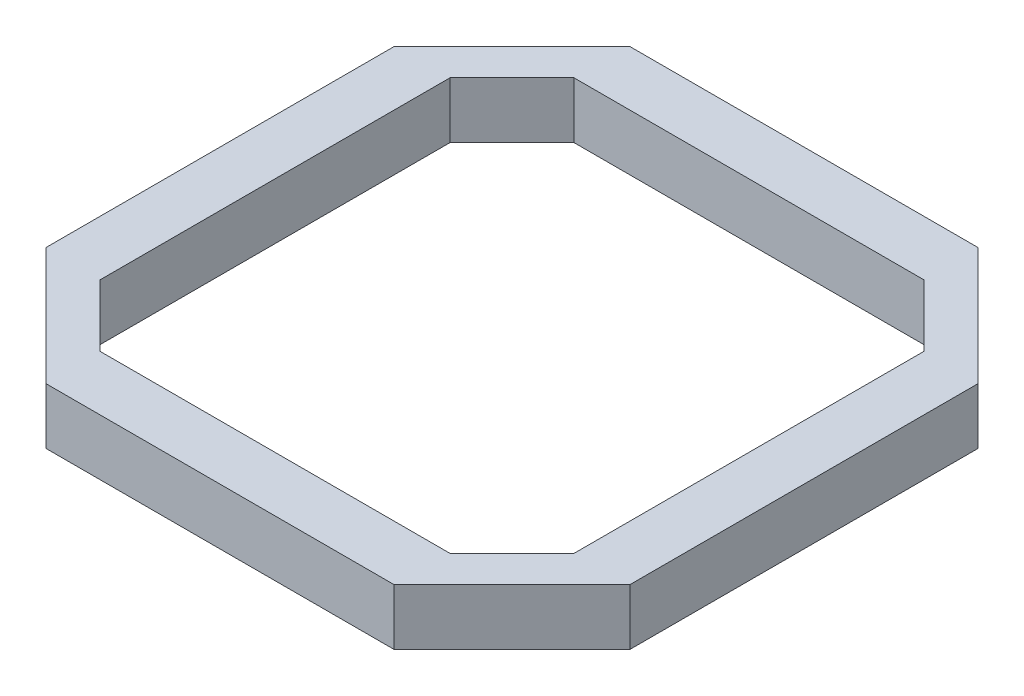
ISO-10303-21;
HEADER;
FILE_DESCRIPTION(('STEP AP214'),'2;1');
FILE_NAME('part.step','',(''),(''),'','','');
FILE_SCHEMA(('AUTOMOTIVE_DESIGN { 1 0 10303 214 1 1 1 1 }'));
ENDSEC;
DATA;
#1=APPLICATION_CONTEXT('core data for automotive mechanical design processes');
#2=APPLICATION_PROTOCOL_DEFINITION('international standard','automotive_design',2000,#1);
#3=PRODUCT_CONTEXT('',#1,'mechanical');
#4=PRODUCT('Part','Part','',(#3));
#5=PRODUCT_RELATED_PRODUCT_CATEGORY('part','',(#4));
#6=PRODUCT_DEFINITION_FORMATION('','',#4);
#7=PRODUCT_DEFINITION_CONTEXT('part definition',#1,'design');
#8=PRODUCT_DEFINITION('design','',#6,#7);
#9=PRODUCT_DEFINITION_SHAPE('','',#8);
#10=(LENGTH_UNIT() NAMED_UNIT(*) SI_UNIT(.MILLI.,.METRE.));
#11=(NAMED_UNIT(*) PLANE_ANGLE_UNIT() SI_UNIT($,.RADIAN.));
#12=(NAMED_UNIT(*) SI_UNIT($,.STERADIAN.) SOLID_ANGLE_UNIT());
#13=UNCERTAINTY_MEASURE_WITH_UNIT(LENGTH_MEASURE(1.E-05),#10,'distance_accuracy_value','');
#14=(GEOMETRIC_REPRESENTATION_CONTEXT(3) GLOBAL_UNCERTAINTY_ASSIGNED_CONTEXT((#13)) GLOBAL_UNIT_ASSIGNED_CONTEXT((#10,
#11,#12)) REPRESENTATION_CONTEXT('',''));
#15=CARTESIAN_POINT('',(0.,0.,0.));
#16=DIRECTION('',(0.,0.,1.));
#17=DIRECTION('',(1.,0.,0.));
#18=AXIS2_PLACEMENT_3D('',#15,#16,#17);
#19=CARTESIAN_POINT('',(-26.,5.,15.5));
#20=DIRECTION('',(0.707106781186551,0.,-0.707106781186544));
#21=DIRECTION('',(-0.707106781186544,0.,-0.707106781186551));
#22=AXIS2_PLACEMENT_3D('',#19,#20,#21);
#23=PLANE('',#22);
#24=DIRECTION('',(0.707106781186544,0.,0.707106781186551));
#25=VECTOR('',#24,1.);
#26=CARTESIAN_POINT('',(-26.,0.,15.5));
#27=LINE('',#26,#25);
#28=CARTESIAN_POINT('',(-26.,0.,15.5));
#29=VERTEX_POINT('',#28);
#30=CARTESIAN_POINT('',(-15.5000000000001,0.,26.));
#31=VERTEX_POINT('',#30);
#32=EDGE_CURVE('E210',#29,#31,#27,.T.);
#33=ORIENTED_EDGE('',*,*,#32,.T.);
#34=DIRECTION('',(0.,-1.,0.));
#35=VECTOR('',#34,1.);
#36=CARTESIAN_POINT('',(-15.5000000000001,5.,26.));
#37=LINE('',#36,#35);
#38=CARTESIAN_POINT('',(-15.5000000000001,5.,26.));
#39=VERTEX_POINT('',#38);
#40=EDGE_CURVE('E11',#39,#31,#37,.T.);
#41=ORIENTED_EDGE('',*,*,#40,.F.);
#42=DIRECTION('',(0.707106781186544,0.,0.707106781186551));
#43=VECTOR('',#42,1.);
#44=CARTESIAN_POINT('',(-26.,5.,15.5));
#45=LINE('',#44,#43);
#46=CARTESIAN_POINT('',(-26.,5.,15.5));
#47=VERTEX_POINT('',#46);
#48=EDGE_CURVE('E222',#47,#39,#45,.T.);
#49=ORIENTED_EDGE('',*,*,#48,.F.);
#50=DIRECTION('',(0.,-1.,0.));
#51=VECTOR('',#50,1.);
#52=CARTESIAN_POINT('',(-26.,5.,15.5));
#53=LINE('',#52,#51);
#54=EDGE_CURVE('E240',#47,#29,#53,.T.);
#55=ORIENTED_EDGE('',*,*,#54,.T.);
#56=EDGE_LOOP('',(#33,#41,#49,#55));
#57=FACE_BOUND('',#56,.T.);
#58=ADVANCED_FACE('F41',(#57),#23,.F.);
#59=CARTESIAN_POINT('',(-15.5000000000001,5.,26.));
#60=DIRECTION('',(0.,0.,-1.));
#61=DIRECTION('',(-1.,0.,0.));
#62=AXIS2_PLACEMENT_3D('',#59,#60,#61);
#63=PLANE('',#62);
#64=DIRECTION('',(1.,0.,0.));
#65=VECTOR('',#64,1.);
#66=CARTESIAN_POINT('',(-15.5000000000001,0.,26.));
#67=LINE('',#66,#65);
#68=CARTESIAN_POINT('',(15.5,0.,26.));
#69=VERTEX_POINT('',#68);
#70=EDGE_CURVE('E243',#31,#69,#67,.T.);
#71=ORIENTED_EDGE('',*,*,#70,.T.);
#72=DIRECTION('',(0.,-1.,0.));
#73=VECTOR('',#72,1.);
#74=CARTESIAN_POINT('',(15.5,5.,26.));
#75=LINE('',#74,#73);
#76=CARTESIAN_POINT('',(15.5,5.,26.));
#77=VERTEX_POINT('',#76);
#78=EDGE_CURVE('E48',#77,#69,#75,.T.);
#79=ORIENTED_EDGE('',*,*,#78,.F.);
#80=DIRECTION('',(1.,0.,0.));
#81=VECTOR('',#80,1.);
#82=CARTESIAN_POINT('',(-15.5000000000001,5.,26.));
#83=LINE('',#82,#81);
#84=EDGE_CURVE('E225',#39,#77,#83,.T.);
#85=ORIENTED_EDGE('',*,*,#84,.F.);
#86=ORIENTED_EDGE('',*,*,#40,.T.);
#87=EDGE_LOOP('',(#71,#79,#85,#86));
#88=FACE_BOUND('',#87,.T.);
#89=ADVANCED_FACE('F298',(#88),#63,.F.);
#90=CARTESIAN_POINT('',(15.5,5.,26.));
#91=DIRECTION('',(-0.707106781186548,0.,-0.707106781186548));
#92=DIRECTION('',(-0.707106781186548,0.,0.707106781186548));
#93=AXIS2_PLACEMENT_3D('',#90,#91,#92);
#94=PLANE('',#93);
#95=DIRECTION('',(0.707106781186548,0.,-0.707106781186548));
#96=VECTOR('',#95,1.);
#97=CARTESIAN_POINT('',(15.5,0.,26.));
#98=LINE('',#97,#96);
#99=CARTESIAN_POINT('',(26.,0.,15.5));
#100=VERTEX_POINT('',#99);
#101=EDGE_CURVE('E245',#69,#100,#98,.T.);
#102=ORIENTED_EDGE('',*,*,#101,.T.);
#103=DIRECTION('',(0.,-1.,0.));
#104=VECTOR('',#103,1.);
#105=CARTESIAN_POINT('',(26.,5.,15.5));
#106=LINE('',#105,#104);
#107=CARTESIAN_POINT('',(26.,5.,15.5));
#108=VERTEX_POINT('',#107);
#109=EDGE_CURVE('E270',#108,#100,#106,.T.);
#110=ORIENTED_EDGE('',*,*,#109,.F.);
#111=DIRECTION('',(0.707106781186548,0.,-0.707106781186548));
#112=VECTOR('',#111,1.);
#113=CARTESIAN_POINT('',(15.5,5.,26.));
#114=LINE('',#113,#112);
#115=EDGE_CURVE('E228',#77,#108,#114,.T.);
#116=ORIENTED_EDGE('',*,*,#115,.F.);
#117=ORIENTED_EDGE('',*,*,#78,.T.);
#118=EDGE_LOOP('',(#102,#110,#116,#117));
#119=FACE_BOUND('',#118,.T.);
#120=ADVANCED_FACE('F277',(#119),#94,.F.);
#121=CARTESIAN_POINT('',(26.,5.,15.5));
#122=DIRECTION('',(-1.,0.,0.));
#123=DIRECTION('',(0.,0.,1.));
#124=AXIS2_PLACEMENT_3D('',#121,#122,#123);
#125=PLANE('',#124);
#126=DIRECTION('',(0.,0.,-1.));
#127=VECTOR('',#126,1.);
#128=CARTESIAN_POINT('',(26.,0.,15.5));
#129=LINE('',#128,#127);
#130=CARTESIAN_POINT('',(26.,0.,-15.4999999999999));
#131=VERTEX_POINT('',#130);
#132=EDGE_CURVE('E247',#100,#131,#129,.T.);
#133=ORIENTED_EDGE('',*,*,#132,.T.);
#134=DIRECTION('',(0.,-1.,0.));
#135=VECTOR('',#134,1.);
#136=CARTESIAN_POINT('',(26.,5.,-15.4999999999999));
#137=LINE('',#136,#135);
#138=CARTESIAN_POINT('',(26.,5.,-15.4999999999999));
#139=VERTEX_POINT('',#138);
#140=EDGE_CURVE('E267',#139,#131,#137,.T.);
#141=ORIENTED_EDGE('',*,*,#140,.F.);
#142=DIRECTION('',(0.,0.,-1.));
#143=VECTOR('',#142,1.);
#144=CARTESIAN_POINT('',(26.,5.,15.5));
#145=LINE('',#144,#143);
#146=EDGE_CURVE('E230',#108,#139,#145,.T.);
#147=ORIENTED_EDGE('',*,*,#146,.F.);
#148=ORIENTED_EDGE('',*,*,#109,.T.);
#149=EDGE_LOOP('',(#133,#141,#147,#148));
#150=FACE_BOUND('',#149,.T.);
#151=ADVANCED_FACE('F286',(#150),#125,.F.);
#152=CARTESIAN_POINT('',(26.,5.,-15.4999999999999));
#153=DIRECTION('',(-0.707106781186547,0.,0.707106781186548));
#154=DIRECTION('',(0.707106781186548,0.,0.707106781186547));
#155=AXIS2_PLACEMENT_3D('',#152,#153,#154);
#156=PLANE('',#155);
#157=DIRECTION('',(-0.707106781186548,0.,-0.707106781186546));
#158=VECTOR('',#157,1.);
#159=CARTESIAN_POINT('',(26.,0.,-15.4999999999999));
#160=LINE('',#159,#158);
#161=CARTESIAN_POINT('',(15.4999999999999,0.,-26.));
#162=VERTEX_POINT('',#161);
#163=EDGE_CURVE('E249',#131,#162,#160,.T.);
#164=ORIENTED_EDGE('',*,*,#163,.T.);
#165=DIRECTION('',(0.,-1.,0.));
#166=VECTOR('',#165,1.);
#167=CARTESIAN_POINT('',(15.4999999999999,5.,-26.));
#168=LINE('',#167,#166);
#169=CARTESIAN_POINT('',(15.4999999999999,5.,-26.));
#170=VERTEX_POINT('',#169);
#171=EDGE_CURVE('E264',#170,#162,#168,.T.);
#172=ORIENTED_EDGE('',*,*,#171,.F.);
#173=DIRECTION('',(-0.707106781186548,0.,-0.707106781186546));
#174=VECTOR('',#173,1.);
#175=CARTESIAN_POINT('',(26.,5.,-15.4999999999999));
#176=LINE('',#175,#174);
#177=EDGE_CURVE('E232',#139,#170,#176,.T.);
#178=ORIENTED_EDGE('',*,*,#177,.F.);
#179=ORIENTED_EDGE('',*,*,#140,.T.);
#180=EDGE_LOOP('',(#164,#172,#178,#179));
#181=FACE_BOUND('',#180,.T.);
#182=ADVANCED_FACE('F290',(#181),#156,.F.);
#183=CARTESIAN_POINT('',(15.4999999999999,5.,-26.));
#184=DIRECTION('',(0.,0.,1.));
#185=DIRECTION('',(1.,0.,0.));
#186=AXIS2_PLACEMENT_3D('',#183,#184,#185);
#187=PLANE('',#186);
#188=DIRECTION('',(-1.,0.,0.));
#189=VECTOR('',#188,1.);
#190=CARTESIAN_POINT('',(15.4999999999999,0.,-26.));
#191=LINE('',#190,#189);
#192=CARTESIAN_POINT('',(-15.5,0.,-26.));
#193=VERTEX_POINT('',#192);
#194=EDGE_CURVE('E251',#162,#193,#191,.T.);
#195=ORIENTED_EDGE('',*,*,#194,.T.);
#196=DIRECTION('',(0.,-1.,0.));
#197=VECTOR('',#196,1.);
#198=CARTESIAN_POINT('',(-15.5,5.,-26.));
#199=LINE('',#198,#197);
#200=CARTESIAN_POINT('',(-15.5,5.,-26.));
#201=VERTEX_POINT('',#200);
#202=EDGE_CURVE('E261',#201,#193,#199,.T.);
#203=ORIENTED_EDGE('',*,*,#202,.F.);
#204=DIRECTION('',(-1.,0.,0.));
#205=VECTOR('',#204,1.);
#206=CARTESIAN_POINT('',(15.4999999999999,5.,-26.));
#207=LINE('',#206,#205);
#208=EDGE_CURVE('E234',#170,#201,#207,.T.);
#209=ORIENTED_EDGE('',*,*,#208,.F.);
#210=ORIENTED_EDGE('',*,*,#171,.T.);
#211=EDGE_LOOP('',(#195,#203,#209,#210));
#212=FACE_BOUND('',#211,.T.);
#213=ADVANCED_FACE('F311',(#212),#187,.F.);
#214=CARTESIAN_POINT('',(-15.5,5.,-26.));
#215=DIRECTION('',(0.707106781186548,0.,0.707106781186547));
#216=DIRECTION('',(0.707106781186547,0.,-0.707106781186548));
#217=AXIS2_PLACEMENT_3D('',#214,#215,#216);
#218=PLANE('',#217);
#219=DIRECTION('',(-0.707106781186547,0.,0.707106781186548));
#220=VECTOR('',#219,1.);
#221=CARTESIAN_POINT('',(-15.5,0.,-26.));
#222=LINE('',#221,#220);
#223=CARTESIAN_POINT('',(-26.,0.,-15.5));
#224=VERTEX_POINT('',#223);
#225=EDGE_CURVE('E253',#193,#224,#222,.T.);
#226=ORIENTED_EDGE('',*,*,#225,.T.);
#227=DIRECTION('',(0.,-1.,0.));
#228=VECTOR('',#227,1.);
#229=CARTESIAN_POINT('',(-26.,5.,-15.5));
#230=LINE('',#229,#228);
#231=CARTESIAN_POINT('',(-26.,5.,-15.5));
#232=VERTEX_POINT('',#231);
#233=EDGE_CURVE('E258',#232,#224,#230,.T.);
#234=ORIENTED_EDGE('',*,*,#233,.F.);
#235=DIRECTION('',(-0.707106781186547,0.,0.707106781186548));
#236=VECTOR('',#235,1.);
#237=CARTESIAN_POINT('',(-15.5,5.,-26.));
#238=LINE('',#237,#236);
#239=EDGE_CURVE('E236',#201,#232,#238,.T.);
#240=ORIENTED_EDGE('',*,*,#239,.F.);
#241=ORIENTED_EDGE('',*,*,#202,.T.);
#242=EDGE_LOOP('',(#226,#234,#240,#241));
#243=FACE_BOUND('',#242,.T.);
#244=ADVANCED_FACE('F309',(#243),#218,.F.);
#245=CARTESIAN_POINT('',(-26.,5.,-15.5));
#246=DIRECTION('',(1.,0.,0.));
#247=DIRECTION('',(0.,0.,-1.));
#248=AXIS2_PLACEMENT_3D('',#245,#246,#247);
#249=PLANE('',#248);
#250=DIRECTION('',(0.,0.,1.));
#251=VECTOR('',#250,1.);
#252=CARTESIAN_POINT('',(-26.,0.,-15.5));
#253=LINE('',#252,#251);
#254=EDGE_CURVE('E226',#224,#29,#253,.T.);
#255=ORIENTED_EDGE('',*,*,#254,.T.);
#256=ORIENTED_EDGE('',*,*,#54,.F.);
#257=DIRECTION('',(0.,0.,1.));
#258=VECTOR('',#257,1.);
#259=CARTESIAN_POINT('',(-26.,5.,-15.5));
#260=LINE('',#259,#258);
#261=EDGE_CURVE('E238',#232,#47,#260,.T.);
#262=ORIENTED_EDGE('',*,*,#261,.F.);
#263=ORIENTED_EDGE('',*,*,#233,.T.);
#264=EDGE_LOOP('',(#255,#256,#262,#263));
#265=FACE_BOUND('',#264,.T.);
#266=ADVANCED_FACE('F304',(#265),#249,.F.);
#267=CARTESIAN_POINT('',(0.,5.,0.));
#268=DIRECTION('',(0.,1.,0.));
#269=DIRECTION('',(0.,0.,1.));
#270=AXIS2_PLACEMENT_3D('',#267,#268,#269);
#271=PLANE('',#270);
#272=DIRECTION('',(0.707106781186547,0.,0.707106781186548));
#273=VECTOR('',#272,1.);
#274=CARTESIAN_POINT('',(-15.6,5.,21.1));
#275=LINE('',#274,#273);
#276=CARTESIAN_POINT('',(-21.1,5.,15.6));
#277=VERTEX_POINT('',#276);
#278=CARTESIAN_POINT('',(-15.6,5.,21.1));
#279=VERTEX_POINT('',#278);
#280=EDGE_CURVE('E55',#277,#279,#275,.T.);
#281=ORIENTED_EDGE('',*,*,#280,.F.);
#282=DIRECTION('',(0.,0.,1.));
#283=VECTOR('',#282,1.);
#284=CARTESIAN_POINT('',(-21.1,5.,15.6));
#285=LINE('',#284,#283);
#286=CARTESIAN_POINT('',(-21.1,5.,-15.6));
#287=VERTEX_POINT('',#286);
#288=EDGE_CURVE('E172',#287,#277,#285,.T.);
#289=ORIENTED_EDGE('',*,*,#288,.F.);
#290=DIRECTION('',(-0.707106781186549,0.,0.707106781186546));
#291=VECTOR('',#290,1.);
#292=CARTESIAN_POINT('',(-21.1,5.,-15.6));
#293=LINE('',#292,#291);
#294=CARTESIAN_POINT('',(-15.6,5.,-21.1));
#295=VERTEX_POINT('',#294);
#296=EDGE_CURVE('E175',#295,#287,#293,.T.);
#297=ORIENTED_EDGE('',*,*,#296,.F.);
#298=DIRECTION('',(-1.,0.,0.));
#299=VECTOR('',#298,1.);
#300=CARTESIAN_POINT('',(-15.6,5.,-21.1));
#301=LINE('',#300,#299);
#302=CARTESIAN_POINT('',(15.6,5.,-21.1));
#303=VERTEX_POINT('',#302);
#304=EDGE_CURVE('E203',#303,#295,#301,.T.);
#305=ORIENTED_EDGE('',*,*,#304,.F.);
#306=DIRECTION('',(-0.707106781186548,0.,-0.707106781186547));
#307=VECTOR('',#306,1.);
#308=CARTESIAN_POINT('',(15.6,5.,-21.1));
#309=LINE('',#308,#307);
#310=CARTESIAN_POINT('',(21.1,5.,-15.6));
#311=VERTEX_POINT('',#310);
#312=EDGE_CURVE('E200',#311,#303,#309,.T.);
#313=ORIENTED_EDGE('',*,*,#312,.F.);
#314=DIRECTION('',(0.,0.,-1.));
#315=VECTOR('',#314,1.);
#316=CARTESIAN_POINT('',(21.1,5.,-15.6));
#317=LINE('',#316,#315);
#318=CARTESIAN_POINT('',(21.1,5.,15.6));
#319=VERTEX_POINT('',#318);
#320=EDGE_CURVE('E197',#319,#311,#317,.T.);
#321=ORIENTED_EDGE('',*,*,#320,.F.);
#322=DIRECTION('',(0.707106781186548,0.,-0.707106781186547));
#323=VECTOR('',#322,1.);
#324=CARTESIAN_POINT('',(21.1,5.,15.6));
#325=LINE('',#324,#323);
#326=CARTESIAN_POINT('',(15.6,5.,21.1));
#327=VERTEX_POINT('',#326);
#328=EDGE_CURVE('E194',#327,#319,#325,.T.);
#329=ORIENTED_EDGE('',*,*,#328,.F.);
#330=DIRECTION('',(1.,0.,0.));
#331=VECTOR('',#330,1.);
#332=CARTESIAN_POINT('',(15.6,5.,21.1));
#333=LINE('',#332,#331);
#334=EDGE_CURVE('E192',#279,#327,#333,.T.);
#335=ORIENTED_EDGE('',*,*,#334,.F.);
#336=EDGE_LOOP('',(#281,#289,#297,#305,#313,#321,#329,#335));
#337=FACE_BOUND('',#336,.T.);
#338=ORIENTED_EDGE('',*,*,#48,.T.);
#339=ORIENTED_EDGE('',*,*,#84,.T.);
#340=ORIENTED_EDGE('',*,*,#115,.T.);
#341=ORIENTED_EDGE('',*,*,#146,.T.);
#342=ORIENTED_EDGE('',*,*,#177,.T.);
#343=ORIENTED_EDGE('',*,*,#208,.T.);
#344=ORIENTED_EDGE('',*,*,#239,.T.);
#345=ORIENTED_EDGE('',*,*,#261,.T.);
#346=EDGE_LOOP('',(#338,#339,#340,#341,#342,#343,#344,#345));
#347=FACE_BOUND('',#346,.T.);
#348=ADVANCED_FACE('F294',(#337,#347),#271,.T.);
#349=CARTESIAN_POINT('',(0.,0.,0.));
#350=DIRECTION('',(0.,1.,0.));
#351=DIRECTION('',(0.,0.,1.));
#352=AXIS2_PLACEMENT_3D('',#349,#350,#351);
#353=PLANE('',#352);
#354=DIRECTION('',(0.,0.,1.));
#355=VECTOR('',#354,1.);
#356=CARTESIAN_POINT('',(-21.1,0.,15.6));
#357=LINE('',#356,#355);
#358=CARTESIAN_POINT('',(-21.1,0.,-15.6));
#359=VERTEX_POINT('',#358);
#360=CARTESIAN_POINT('',(-21.1,0.,15.6));
#361=VERTEX_POINT('',#360);
#362=EDGE_CURVE('E161',#359,#361,#357,.T.);
#363=ORIENTED_EDGE('',*,*,#362,.T.);
#364=DIRECTION('',(0.707106781186547,0.,0.707106781186548));
#365=VECTOR('',#364,1.);
#366=CARTESIAN_POINT('',(-15.6,0.,21.1));
#367=LINE('',#366,#365);
#368=CARTESIAN_POINT('',(-15.6,0.,21.1));
#369=VERTEX_POINT('',#368);
#370=EDGE_CURVE('E155',#361,#369,#367,.T.);
#371=ORIENTED_EDGE('',*,*,#370,.T.);
#372=DIRECTION('',(1.,0.,0.));
#373=VECTOR('',#372,1.);
#374=CARTESIAN_POINT('',(15.6,0.,21.1));
#375=LINE('',#374,#373);
#376=CARTESIAN_POINT('',(15.6,0.,21.1));
#377=VERTEX_POINT('',#376);
#378=EDGE_CURVE('E164',#369,#377,#375,.T.);
#379=ORIENTED_EDGE('',*,*,#378,.T.);
#380=DIRECTION('',(0.707106781186548,0.,-0.707106781186547));
#381=VECTOR('',#380,1.);
#382=CARTESIAN_POINT('',(21.1,0.,15.6));
#383=LINE('',#382,#381);
#384=CARTESIAN_POINT('',(21.1,0.,15.6));
#385=VERTEX_POINT('',#384);
#386=EDGE_CURVE('E63',#377,#385,#383,.T.);
#387=ORIENTED_EDGE('',*,*,#386,.T.);
#388=DIRECTION('',(0.,0.,-1.));
#389=VECTOR('',#388,1.);
#390=CARTESIAN_POINT('',(21.1,0.,-15.6));
#391=LINE('',#390,#389);
#392=CARTESIAN_POINT('',(21.1,0.,-15.6));
#393=VERTEX_POINT('',#392);
#394=EDGE_CURVE('E179',#385,#393,#391,.T.);
#395=ORIENTED_EDGE('',*,*,#394,.T.);
#396=DIRECTION('',(-0.707106781186548,0.,-0.707106781186547));
#397=VECTOR('',#396,1.);
#398=CARTESIAN_POINT('',(15.6,0.,-21.1));
#399=LINE('',#398,#397);
#400=CARTESIAN_POINT('',(15.6,0.,-21.1));
#401=VERTEX_POINT('',#400);
#402=EDGE_CURVE('E182',#393,#401,#399,.T.);
#403=ORIENTED_EDGE('',*,*,#402,.T.);
#404=DIRECTION('',(-1.,0.,0.));
#405=VECTOR('',#404,1.);
#406=CARTESIAN_POINT('',(-15.6,0.,-21.1));
#407=LINE('',#406,#405);
#408=CARTESIAN_POINT('',(-15.6,0.,-21.1));
#409=VERTEX_POINT('',#408);
#410=EDGE_CURVE('E185',#401,#409,#407,.T.);
#411=ORIENTED_EDGE('',*,*,#410,.T.);
#412=DIRECTION('',(-0.707106781186549,0.,0.707106781186546));
#413=VECTOR('',#412,1.);
#414=CARTESIAN_POINT('',(-21.1,0.,-15.6));
#415=LINE('',#414,#413);
#416=EDGE_CURVE('E188',#409,#359,#415,.T.);
#417=ORIENTED_EDGE('',*,*,#416,.T.);
#418=EDGE_LOOP('',(#363,#371,#379,#387,#395,#403,#411,#417));
#419=FACE_BOUND('',#418,.T.);
#420=ORIENTED_EDGE('',*,*,#32,.F.);
#421=ORIENTED_EDGE('',*,*,#254,.F.);
#422=ORIENTED_EDGE('',*,*,#225,.F.);
#423=ORIENTED_EDGE('',*,*,#194,.F.);
#424=ORIENTED_EDGE('',*,*,#163,.F.);
#425=ORIENTED_EDGE('',*,*,#132,.F.);
#426=ORIENTED_EDGE('',*,*,#101,.F.);
#427=ORIENTED_EDGE('',*,*,#70,.F.);
#428=EDGE_LOOP('',(#420,#421,#422,#423,#424,#425,#426,#427));
#429=FACE_BOUND('',#428,.T.);
#430=ADVANCED_FACE('F168',(#419,#429),#353,.F.);
#431=CARTESIAN_POINT('',(-15.6,0.,21.1));
#432=DIRECTION('',(-0.707106781186548,0.,0.707106781186547));
#433=DIRECTION('',(0.707106781186547,0.,0.707106781186548));
#434=AXIS2_PLACEMENT_3D('',#431,#432,#433);
#435=PLANE('',#434);
#436=ORIENTED_EDGE('',*,*,#280,.T.);
#437=DIRECTION('',(0.,1.,0.));
#438=VECTOR('',#437,1.);
#439=CARTESIAN_POINT('',(-15.6,0.,21.1));
#440=LINE('',#439,#438);
#441=EDGE_CURVE('E151',#369,#279,#440,.T.);
#442=ORIENTED_EDGE('',*,*,#441,.F.);
#443=ORIENTED_EDGE('',*,*,#370,.F.);
#444=DIRECTION('',(0.,1.,0.));
#445=VECTOR('',#444,1.);
#446=CARTESIAN_POINT('',(-21.1,0.,15.6));
#447=LINE('',#446,#445);
#448=EDGE_CURVE('E208',#361,#277,#447,.T.);
#449=ORIENTED_EDGE('',*,*,#448,.T.);
#450=EDGE_LOOP('',(#436,#442,#443,#449));
#451=FACE_BOUND('',#450,.T.);
#452=ADVANCED_FACE('F153',(#451),#435,.F.);
#453=CARTESIAN_POINT('',(-21.1,0.,15.6));
#454=DIRECTION('',(-1.,0.,0.));
#455=DIRECTION('',(0.,0.,1.));
#456=AXIS2_PLACEMENT_3D('',#453,#454,#455);
#457=PLANE('',#456);
#458=ORIENTED_EDGE('',*,*,#288,.T.);
#459=ORIENTED_EDGE('',*,*,#448,.F.);
#460=ORIENTED_EDGE('',*,*,#362,.F.);
#461=DIRECTION('',(0.,1.,0.));
#462=VECTOR('',#461,1.);
#463=CARTESIAN_POINT('',(-21.1,0.,-15.6));
#464=LINE('',#463,#462);
#465=EDGE_CURVE('E211',#359,#287,#464,.T.);
#466=ORIENTED_EDGE('',*,*,#465,.T.);
#467=EDGE_LOOP('',(#458,#459,#460,#466));
#468=FACE_BOUND('',#467,.T.);
#469=ADVANCED_FACE('F384',(#468),#457,.F.);
#470=CARTESIAN_POINT('',(-21.1,0.,-15.6));
#471=DIRECTION('',(-0.707106781186546,0.,-0.707106781186549));
#472=DIRECTION('',(-0.707106781186549,0.,0.707106781186546));
#473=AXIS2_PLACEMENT_3D('',#470,#471,#472);
#474=PLANE('',#473);
#475=ORIENTED_EDGE('',*,*,#296,.T.);
#476=ORIENTED_EDGE('',*,*,#465,.F.);
#477=ORIENTED_EDGE('',*,*,#416,.F.);
#478=DIRECTION('',(0.,1.,0.));
#479=VECTOR('',#478,1.);
#480=CARTESIAN_POINT('',(-15.6,0.,-21.1));
#481=LINE('',#480,#479);
#482=EDGE_CURVE('E213',#409,#295,#481,.T.);
#483=ORIENTED_EDGE('',*,*,#482,.T.);
#484=EDGE_LOOP('',(#475,#476,#477,#483));
#485=FACE_BOUND('',#484,.T.);
#486=ADVANCED_FACE('F393',(#485),#474,.F.);
#487=CARTESIAN_POINT('',(-15.6,0.,-21.1));
#488=DIRECTION('',(0.,0.,-1.));
#489=DIRECTION('',(-1.,0.,0.));
#490=AXIS2_PLACEMENT_3D('',#487,#488,#489);
#491=PLANE('',#490);
#492=ORIENTED_EDGE('',*,*,#304,.T.);
#493=ORIENTED_EDGE('',*,*,#482,.F.);
#494=ORIENTED_EDGE('',*,*,#410,.F.);
#495=DIRECTION('',(0.,1.,0.));
#496=VECTOR('',#495,1.);
#497=CARTESIAN_POINT('',(15.6,0.,-21.1));
#498=LINE('',#497,#496);
#499=EDGE_CURVE('E215',#401,#303,#498,.T.);
#500=ORIENTED_EDGE('',*,*,#499,.T.);
#501=EDGE_LOOP('',(#492,#493,#494,#500));
#502=FACE_BOUND('',#501,.T.);
#503=ADVANCED_FACE('F403',(#502),#491,.F.);
#504=CARTESIAN_POINT('',(15.6,0.,-21.1));
#505=DIRECTION('',(0.707106781186547,0.,-0.707106781186548));
#506=DIRECTION('',(-0.707106781186548,0.,-0.707106781186547));
#507=AXIS2_PLACEMENT_3D('',#504,#505,#506);
#508=PLANE('',#507);
#509=ORIENTED_EDGE('',*,*,#312,.T.);
#510=ORIENTED_EDGE('',*,*,#499,.F.);
#511=ORIENTED_EDGE('',*,*,#402,.F.);
#512=DIRECTION('',(0.,1.,0.));
#513=VECTOR('',#512,1.);
#514=CARTESIAN_POINT('',(21.1,0.,-15.6));
#515=LINE('',#514,#513);
#516=EDGE_CURVE('E217',#393,#311,#515,.T.);
#517=ORIENTED_EDGE('',*,*,#516,.T.);
#518=EDGE_LOOP('',(#509,#510,#511,#517));
#519=FACE_BOUND('',#518,.T.);
#520=ADVANCED_FACE('F413',(#519),#508,.F.);
#521=CARTESIAN_POINT('',(21.1,0.,-15.6));
#522=DIRECTION('',(1.,0.,0.));
#523=DIRECTION('',(0.,0.,-1.));
#524=AXIS2_PLACEMENT_3D('',#521,#522,#523);
#525=PLANE('',#524);
#526=ORIENTED_EDGE('',*,*,#320,.T.);
#527=ORIENTED_EDGE('',*,*,#516,.F.);
#528=ORIENTED_EDGE('',*,*,#394,.F.);
#529=DIRECTION('',(0.,1.,0.));
#530=VECTOR('',#529,1.);
#531=CARTESIAN_POINT('',(21.1,0.,15.6));
#532=LINE('',#531,#530);
#533=EDGE_CURVE('E219',#385,#319,#532,.T.);
#534=ORIENTED_EDGE('',*,*,#533,.T.);
#535=EDGE_LOOP('',(#526,#527,#528,#534));
#536=FACE_BOUND('',#535,.T.);
#537=ADVANCED_FACE('F423',(#536),#525,.F.);
#538=CARTESIAN_POINT('',(21.1,0.,15.6));
#539=DIRECTION('',(0.707106781186547,0.,0.707106781186548));
#540=DIRECTION('',(0.707106781186548,0.,-0.707106781186547));
#541=AXIS2_PLACEMENT_3D('',#538,#539,#540);
#542=PLANE('',#541);
#543=ORIENTED_EDGE('',*,*,#328,.T.);
#544=ORIENTED_EDGE('',*,*,#533,.F.);
#545=ORIENTED_EDGE('',*,*,#386,.F.);
#546=DIRECTION('',(0.,1.,0.));
#547=VECTOR('',#546,1.);
#548=CARTESIAN_POINT('',(15.6,0.,21.1));
#549=LINE('',#548,#547);
#550=EDGE_CURVE('E160',#377,#327,#549,.T.);
#551=ORIENTED_EDGE('',*,*,#550,.T.);
#552=EDGE_LOOP('',(#543,#544,#545,#551));
#553=FACE_BOUND('',#552,.T.);
#554=ADVANCED_FACE('F433',(#553),#542,.F.);
#555=CARTESIAN_POINT('',(15.6,0.,21.1));
#556=DIRECTION('',(0.,0.,1.));
#557=DIRECTION('',(1.,0.,0.));
#558=AXIS2_PLACEMENT_3D('',#555,#556,#557);
#559=PLANE('',#558);
#560=ORIENTED_EDGE('',*,*,#334,.T.);
#561=ORIENTED_EDGE('',*,*,#550,.F.);
#562=ORIENTED_EDGE('',*,*,#378,.F.);
#563=ORIENTED_EDGE('',*,*,#441,.T.);
#564=EDGE_LOOP('',(#560,#561,#562,#563));
#565=FACE_BOUND('',#564,.T.);
#566=ADVANCED_FACE('F165',(#565),#559,.F.);
#567=CLOSED_SHELL('',(#58,#89,#120,#151,#182,#213,#244,#266,#348,#430,#452,#469,#486,#503,#520,
#537,#554,#566));
#568=MANIFOLD_SOLID_BREP('B2',#567);
#569=ADVANCED_BREP_SHAPE_REPRESENTATION('',(#18,#568),#14);
#570=SHAPE_DEFINITION_REPRESENTATION(#9,#569);
ENDSEC;
END-ISO-10303-21;
